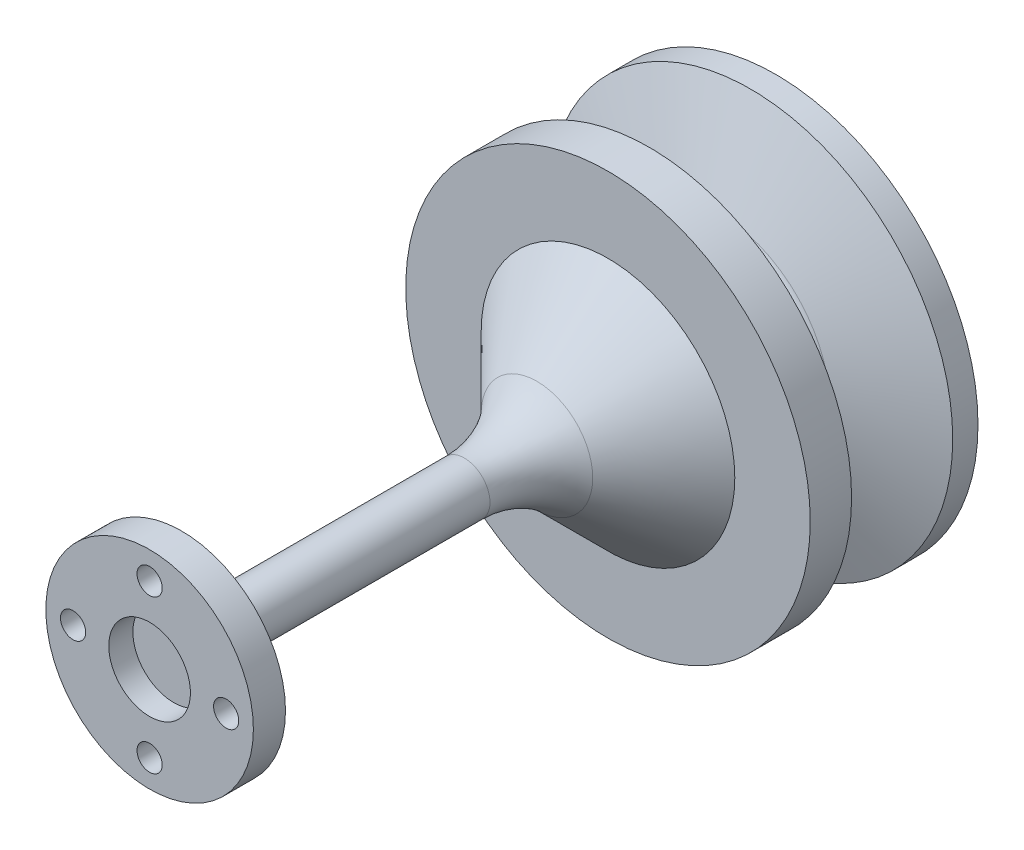
ISO-10303-21;
HEADER;
FILE_DESCRIPTION(('STEP AP214'),'2;1');
FILE_NAME('part.step','',(''),(''),'','','');
FILE_SCHEMA(('AUTOMOTIVE_DESIGN { 1 0 10303 214 1 1 1 1 }'));
ENDSEC;
DATA;
#1=APPLICATION_CONTEXT('core data for automotive mechanical design processes');
#2=APPLICATION_PROTOCOL_DEFINITION('international standard','automotive_design',2000,#1);
#3=PRODUCT_CONTEXT('',#1,'mechanical');
#4=PRODUCT('Part','Part','',(#3));
#5=PRODUCT_RELATED_PRODUCT_CATEGORY('part','',(#4));
#6=PRODUCT_DEFINITION_FORMATION('','',#4);
#7=PRODUCT_DEFINITION_CONTEXT('part definition',#1,'design');
#8=PRODUCT_DEFINITION('design','',#6,#7);
#9=PRODUCT_DEFINITION_SHAPE('','',#8);
#10=(LENGTH_UNIT() NAMED_UNIT(*) SI_UNIT(.MILLI.,.METRE.));
#11=(NAMED_UNIT(*) PLANE_ANGLE_UNIT() SI_UNIT($,.RADIAN.));
#12=(NAMED_UNIT(*) SI_UNIT($,.STERADIAN.) SOLID_ANGLE_UNIT());
#13=UNCERTAINTY_MEASURE_WITH_UNIT(LENGTH_MEASURE(1.E-05),#10,'distance_accuracy_value','');
#14=(GEOMETRIC_REPRESENTATION_CONTEXT(3) GLOBAL_UNCERTAINTY_ASSIGNED_CONTEXT((#13)) GLOBAL_UNIT_ASSIGNED_CONTEXT((#10,
#11,#12)) REPRESENTATION_CONTEXT('',''));
#15=CARTESIAN_POINT('',(0.,0.,0.));
#16=DIRECTION('',(0.,0.,1.));
#17=DIRECTION('',(1.,0.,0.));
#18=AXIS2_PLACEMENT_3D('',#15,#16,#17);
#19=CARTESIAN_POINT('',(0.,0.,7.5));
#20=DIRECTION('',(0.,0.,-1.));
#21=DIRECTION('',(-1.,0.,0.));
#22=AXIS2_PLACEMENT_3D('',#19,#20,#21);
#23=CYLINDRICAL_SURFACE('',#22,20.);
#24=CARTESIAN_POINT('',(0.,0.,5.));
#25=DIRECTION('',(0.,0.,1.));
#26=DIRECTION('',(1.,0.,0.));
#27=AXIS2_PLACEMENT_3D('',#24,#25,#26);
#28=CIRCLE('',#27,20.);
#29=CARTESIAN_POINT('',(20.,0.,5.));
#30=VERTEX_POINT('',#29);
#31=EDGE_CURVE('E70',#30,#30,#28,.T.);
#32=ORIENTED_EDGE('',*,*,#31,.T.);
#33=EDGE_LOOP('',(#32));
#34=FACE_BOUND('',#33,.T.);
#35=CARTESIAN_POINT('',(0.,0.,9.0875));
#36=DIRECTION('',(0.,0.,1.));
#37=DIRECTION('',(1.,0.,0.));
#38=AXIS2_PLACEMENT_3D('',#35,#36,#37);
#39=CIRCLE('',#38,20.);
#40=CARTESIAN_POINT('',(20.,0.,9.0875));
#41=VERTEX_POINT('',#40);
#42=EDGE_CURVE('E80',#41,#41,#39,.T.);
#43=ORIENTED_EDGE('',*,*,#42,.F.);
#44=EDGE_LOOP('',(#43));
#45=FACE_BOUND('',#44,.T.);
#46=ADVANCED_FACE('F38',(#34,#45),#23,.T.);
#47=CARTESIAN_POINT('',(0.,0.,5.));
#48=DIRECTION('',(0.,0.,1.));
#49=DIRECTION('',(1.,0.,0.));
#50=AXIS2_PLACEMENT_3D('',#47,#48,#49);
#51=CONICAL_SURFACE('',#50,20.,1.21861155690498);
#52=CARTESIAN_POINT('',(0.,0.,1.73418644074159));
#53=DIRECTION('',(0.,0.,1.));
#54=DIRECTION('',(1.,0.,0.));
#55=AXIS2_PLACEMENT_3D('',#52,#53,#54);
#56=CIRCLE('',#55,11.1135861888469);
#57=CARTESIAN_POINT('',(11.1135861888469,0.,1.73418644074159));
#58=VERTEX_POINT('',#57);
#59=EDGE_CURVE('E58',#58,#58,#56,.T.);
#60=ORIENTED_EDGE('',*,*,#59,.T.);
#61=EDGE_LOOP('',(#60));
#62=FACE_BOUND('',#61,.T.);
#63=ORIENTED_EDGE('',*,*,#31,.F.);
#64=EDGE_LOOP('',(#63));
#65=FACE_BOUND('',#64,.T.);
#66=ADVANCED_FACE('F169',(#62,#65),#51,.T.);
#67=CARTESIAN_POINT('',(0.,0.,15.7885726147612));
#68=DIRECTION('',(0.,0.,1.));
#69=DIRECTION('',(1.,0.,0.));
#70=AXIS2_PLACEMENT_3D('',#67,#68,#69);
#71=CYLINDRICAL_SURFACE('',#70,10.);
#72=CARTESIAN_POINT('',(0.,0.,0.138530198912253));
#73=DIRECTION('',(0.,0.,1.));
#74=DIRECTION('',(1.,0.,0.));
#75=AXIS2_PLACEMENT_3D('',#72,#73,#74);
#76=CIRCLE('',#75,10.);
#77=CARTESIAN_POINT('',(10.,0.,0.138530198912253));
#78=VERTEX_POINT('',#77);
#79=EDGE_CURVE('E53',#78,#78,#76,.F.);
#80=ORIENTED_EDGE('',*,*,#79,.T.);
#81=EDGE_LOOP('',(#80));
#82=FACE_BOUND('',#81,.T.);
#83=CARTESIAN_POINT('',(0.,0.,-0.138530198912256));
#84=DIRECTION('',(0.,0.,1.));
#85=DIRECTION('',(1.,0.,0.));
#86=AXIS2_PLACEMENT_3D('',#83,#84,#85);
#87=CIRCLE('',#86,10.);
#88=CARTESIAN_POINT('',(10.,0.,-0.138530198912256));
#89=VERTEX_POINT('',#88);
#90=EDGE_CURVE('E64',#89,#89,#87,.T.);
#91=ORIENTED_EDGE('',*,*,#90,.T.);
#92=EDGE_LOOP('',(#91));
#93=FACE_BOUND('',#92,.T.);
#94=ADVANCED_FACE('F176',(#82,#93),#71,.T.);
#95=CARTESIAN_POINT('',(0.,0.,-1.32493643818434));
#96=DIRECTION('',(0.,0.,-1.));
#97=DIRECTION('',(-1.,0.,0.));
#98=AXIS2_PLACEMENT_3D('',#95,#96,#97);
#99=CONICAL_SURFACE('',#98,10.,1.21861155690498);
#100=CARTESIAN_POINT('',(0.,0.,-1.73418644074159));
#101=DIRECTION('',(0.,0.,-1.));
#102=DIRECTION('',(-1.,0.,0.));
#103=AXIS2_PLACEMENT_3D('',#100,#101,#102);
#104=CIRCLE('',#103,11.1135861888469);
#105=CARTESIAN_POINT('',(-11.1135861888469,0.,-1.73418644074159));
#106=VERTEX_POINT('',#105);
#107=EDGE_CURVE('E61',#106,#106,#104,.T.);
#108=ORIENTED_EDGE('',*,*,#107,.T.);
#109=EDGE_LOOP('',(#108));
#110=FACE_BOUND('',#109,.T.);
#111=CARTESIAN_POINT('',(0.,0.,-5.));
#112=DIRECTION('',(0.,0.,1.));
#113=DIRECTION('',(1.,0.,0.));
#114=AXIS2_PLACEMENT_3D('',#111,#112,#113);
#115=CIRCLE('',#114,20.);
#116=CARTESIAN_POINT('',(20.,0.,-5.));
#117=VERTEX_POINT('',#116);
#118=EDGE_CURVE('E73',#117,#117,#115,.T.);
#119=ORIENTED_EDGE('',*,*,#118,.T.);
#120=EDGE_LOOP('',(#119));
#121=FACE_BOUND('',#120,.T.);
#122=ADVANCED_FACE('F192',(#110,#121),#99,.T.);
#123=CARTESIAN_POINT('',(0.,0.,-7.5));
#124=DIRECTION('',(0.,0.,1.));
#125=DIRECTION('',(1.,0.,0.));
#126=AXIS2_PLACEMENT_3D('',#123,#124,#125);
#127=PLANE('',#126);
#128=CARTESIAN_POINT('',(0.,0.,-7.5));
#129=DIRECTION('',(0.,0.,1.));
#130=DIRECTION('',(1.,0.,0.));
#131=AXIS2_PLACEMENT_3D('',#128,#129,#130);
#132=CIRCLE('',#131,5.);
#133=CARTESIAN_POINT('',(5.,0.,-7.5));
#134=VERTEX_POINT('',#133);
#135=EDGE_CURVE('E76',#134,#134,#132,.T.);
#136=ORIENTED_EDGE('',*,*,#135,.T.);
#137=EDGE_LOOP('',(#136));
#138=FACE_BOUND('',#137,.T.);
#139=CARTESIAN_POINT('',(0.,0.,-7.5));
#140=DIRECTION('',(0.,0.,1.));
#141=DIRECTION('',(1.,0.,0.));
#142=AXIS2_PLACEMENT_3D('',#139,#140,#141);
#143=CIRCLE('',#142,20.);
#144=CARTESIAN_POINT('',(20.,0.,-7.5));
#145=VERTEX_POINT('',#144);
#146=EDGE_CURVE('E67',#145,#145,#143,.T.);
#147=ORIENTED_EDGE('',*,*,#146,.F.);
#148=EDGE_LOOP('',(#147));
#149=FACE_BOUND('',#148,.T.);
#150=ADVANCED_FACE('F184',(#138,#149),#127,.F.);
#151=ORIENTED_EDGE('',*,*,#146,.T.);
#152=EDGE_LOOP('',(#151));
#153=FACE_BOUND('',#152,.T.);
#154=ORIENTED_EDGE('',*,*,#118,.F.);
#155=EDGE_LOOP('',(#154));
#156=FACE_BOUND('',#155,.T.);
#157=ADVANCED_FACE('F172',(#153,#156),#23,.T.);
#158=CARTESIAN_POINT('',(0.,0.,-0.138530198912255));
#159=DIRECTION('',(0.,0.,1.));
#160=DIRECTION('',(1.,0.,0.));
#161=AXIS2_PLACEMENT_3D('',#158,#159,#160);
#162=TOROIDAL_SURFACE('',#161,11.7,1.7);
#163=ORIENTED_EDGE('',*,*,#107,.F.);
#164=EDGE_LOOP('',(#163));
#165=FACE_BOUND('',#164,.T.);
#166=ORIENTED_EDGE('',*,*,#90,.F.);
#167=EDGE_LOOP('',(#166));
#168=FACE_BOUND('',#167,.T.);
#169=ADVANCED_FACE('F183',(#165,#168),#162,.F.);
#170=CARTESIAN_POINT('',(0.,0.,0.138530198912253));
#171=DIRECTION('',(0.,0.,1.));
#172=DIRECTION('',(1.,0.,0.));
#173=AXIS2_PLACEMENT_3D('',#170,#171,#172);
#174=TOROIDAL_SURFACE('',#173,11.7,1.7);
#175=ORIENTED_EDGE('',*,*,#79,.F.);
#176=EDGE_LOOP('',(#175));
#177=FACE_BOUND('',#176,.T.);
#178=ORIENTED_EDGE('',*,*,#59,.F.);
#179=EDGE_LOOP('',(#178));
#180=FACE_BOUND('',#179,.T.);
#181=ADVANCED_FACE('F190',(#177,#180),#174,.F.);
#182=CARTESIAN_POINT('',(0.,0.,-7.5));
#183=DIRECTION('',(0.,0.,1.));
#184=DIRECTION('',(1.,0.,0.));
#185=AXIS2_PLACEMENT_3D('',#182,#183,#184);
#186=CYLINDRICAL_SURFACE('',#185,5.);
#187=ORIENTED_EDGE('',*,*,#135,.F.);
#188=EDGE_LOOP('',(#187));
#189=FACE_BOUND('',#188,.T.);
#190=CARTESIAN_POINT('',(0.,0.,7.5));
#191=DIRECTION('',(0.,0.,1.));
#192=DIRECTION('',(1.,0.,0.));
#193=AXIS2_PLACEMENT_3D('',#190,#191,#192);
#194=CIRCLE('',#193,5.);
#195=CARTESIAN_POINT('',(5.,0.,7.5));
#196=VERTEX_POINT('',#195);
#197=EDGE_CURVE('E77',#196,#196,#194,.T.);
#198=ORIENTED_EDGE('',*,*,#197,.T.);
#199=EDGE_LOOP('',(#198));
#200=FACE_BOUND('',#199,.T.);
#201=ADVANCED_FACE('F207',(#189,#200),#186,.F.);
#202=CARTESIAN_POINT('',(0.,0.,7.5));
#203=DIRECTION('',(0.,0.,1.));
#204=DIRECTION('',(1.,0.,0.));
#205=AXIS2_PLACEMENT_3D('',#202,#203,#204);
#206=PLANE('',#205);
#207=ORIENTED_EDGE('',*,*,#197,.F.);
#208=EDGE_LOOP('',(#207));
#209=FACE_BOUND('',#208,.T.);
#210=ADVANCED_FACE('F210',(#209),#206,.F.);
#211=CARTESIAN_POINT('',(0.,0.,9.0875));
#212=DIRECTION('',(0.,0.,1.));
#213=DIRECTION('',(1.,0.,0.));
#214=AXIS2_PLACEMENT_3D('',#211,#212,#213);
#215=PLANE('',#214);
#216=CARTESIAN_POINT('',(0.,0.,9.0875));
#217=DIRECTION('',(0.,0.,1.));
#218=DIRECTION('',(1.,0.,0.));
#219=AXIS2_PLACEMENT_3D('',#216,#217,#218);
#220=CIRCLE('',#219,12.5400000000001);
#221=CARTESIAN_POINT('',(12.5400000000001,0.,9.0875));
#222=VERTEX_POINT('',#221);
#223=EDGE_CURVE('E49',#222,#222,#220,.F.);
#224=ORIENTED_EDGE('',*,*,#223,.T.);
#225=EDGE_LOOP('',(#224));
#226=FACE_BOUND('',#225,.T.);
#227=ORIENTED_EDGE('',*,*,#42,.T.);
#228=EDGE_LOOP('',(#227));
#229=FACE_BOUND('',#228,.T.);
#230=ADVANCED_FACE('F214',(#226,#229),#215,.T.);
#231=CARTESIAN_POINT('',(0.,0.,51.2388));
#232=DIRECTION('',(0.,0.,-1.));
#233=DIRECTION('',(-1.,0.,0.));
#234=AXIS2_PLACEMENT_3D('',#231,#232,#233);
#235=CYLINDRICAL_SURFACE('',#234,2.54);
#236=CARTESIAN_POINT('',(0.,0.,23.2959097937106));
#237=DIRECTION('',(0.,0.,1.));
#238=DIRECTION('',(1.,0.,0.));
#239=AXIS2_PLACEMENT_3D('',#236,#237,#238);
#240=CIRCLE('',#239,2.54);
#241=CARTESIAN_POINT('',(2.54,0.,23.2959097937106));
#242=VERTEX_POINT('',#241);
#243=EDGE_CURVE('E45',#242,#242,#240,.T.);
#244=ORIENTED_EDGE('',*,*,#243,.T.);
#245=EDGE_LOOP('',(#244));
#246=FACE_BOUND('',#245,.T.);
#247=CARTESIAN_POINT('',(0.,0.,51.2388));
#248=DIRECTION('',(0.,0.,1.));
#249=DIRECTION('',(1.,0.,0.));
#250=AXIS2_PLACEMENT_3D('',#247,#248,#249);
#251=CIRCLE('',#250,2.54);
#252=CARTESIAN_POINT('',(2.54,0.,51.2388));
#253=VERTEX_POINT('',#252);
#254=EDGE_CURVE('E85',#253,#253,#251,.T.);
#255=ORIENTED_EDGE('',*,*,#254,.F.);
#256=EDGE_LOOP('',(#255));
#257=FACE_BOUND('',#256,.T.);
#258=ADVANCED_FACE('F152',(#246,#257),#235,.T.);
#259=CARTESIAN_POINT('',(0.,0.,54.4138));
#260=DIRECTION('',(0.,0.,-1.));
#261=DIRECTION('',(-1.,0.,0.));
#262=AXIS2_PLACEMENT_3D('',#259,#260,#261);
#263=CYLINDRICAL_SURFACE('',#262,10.2616);
#264=CARTESIAN_POINT('',(0.,0.,54.4138));
#265=DIRECTION('',(0.,0.,1.));
#266=DIRECTION('',(1.,0.,0.));
#267=AXIS2_PLACEMENT_3D('',#264,#265,#266);
#268=CIRCLE('',#267,10.2616);
#269=CARTESIAN_POINT('',(10.2616,0.,54.4138));
#270=VERTEX_POINT('',#269);
#271=EDGE_CURVE('E88',#270,#270,#268,.T.);
#272=ORIENTED_EDGE('',*,*,#271,.F.);
#273=EDGE_LOOP('',(#272));
#274=FACE_BOUND('',#273,.T.);
#275=CARTESIAN_POINT('',(0.,0.,51.2388));
#276=DIRECTION('',(0.,0.,1.));
#277=DIRECTION('',(1.,0.,0.));
#278=AXIS2_PLACEMENT_3D('',#275,#276,#277);
#279=CIRCLE('',#278,10.2616);
#280=CARTESIAN_POINT('',(10.2616,0.,51.2388));
#281=VERTEX_POINT('',#280);
#282=EDGE_CURVE('E89',#281,#281,#279,.T.);
#283=ORIENTED_EDGE('',*,*,#282,.T.);
#284=EDGE_LOOP('',(#283));
#285=FACE_BOUND('',#284,.T.);
#286=ADVANCED_FACE('F138',(#274,#285),#263,.T.);
#287=CARTESIAN_POINT('',(0.,0.,54.4138));
#288=DIRECTION('',(0.,0.,1.));
#289=DIRECTION('',(1.,0.,0.));
#290=AXIS2_PLACEMENT_3D('',#287,#288,#289);
#291=PLANE('',#290);
#292=CARTESIAN_POINT('',(0.,0.,54.4138));
#293=DIRECTION('',(0.,0.,1.));
#294=DIRECTION('',(1.,0.,0.));
#295=AXIS2_PLACEMENT_3D('',#292,#293,#294);
#296=CIRCLE('',#295,4.0386);
#297=CARTESIAN_POINT('',(4.0386,0.,54.4138));
#298=VERTEX_POINT('',#297);
#299=EDGE_CURVE('E119',#298,#298,#296,.T.);
#300=ORIENTED_EDGE('',*,*,#299,.F.);
#301=EDGE_LOOP('',(#300));
#302=FACE_BOUND('',#301,.T.);
#303=CARTESIAN_POINT('',(-7.5692,0.,54.4138));
#304=DIRECTION('',(0.,0.,1.));
#305=DIRECTION('',(0.,1.,0.));
#306=AXIS2_PLACEMENT_3D('',#303,#304,#305);
#307=CIRCLE('',#306,1.2446);
#308=CARTESIAN_POINT('',(-7.5692,1.24459999999997,54.4138));
#309=VERTEX_POINT('',#308);
#310=EDGE_CURVE('E112',#309,#309,#307,.T.);
#311=ORIENTED_EDGE('',*,*,#310,.F.);
#312=EDGE_LOOP('',(#311));
#313=FACE_BOUND('',#312,.T.);
#314=CARTESIAN_POINT('',(0.,-7.5692,54.4138));
#315=DIRECTION('',(0.,0.,1.));
#316=DIRECTION('',(-1.,0.,0.));
#317=AXIS2_PLACEMENT_3D('',#314,#315,#316);
#318=CIRCLE('',#317,1.2446);
#319=CARTESIAN_POINT('',(-1.2446,-7.5692,54.4138));
#320=VERTEX_POINT('',#319);
#321=EDGE_CURVE('E104',#320,#320,#318,.T.);
#322=ORIENTED_EDGE('',*,*,#321,.F.);
#323=EDGE_LOOP('',(#322));
#324=FACE_BOUND('',#323,.T.);
#325=CARTESIAN_POINT('',(7.5692,0.,54.4138));
#326=DIRECTION('',(0.,0.,1.));
#327=DIRECTION('',(0.,-1.,0.));
#328=AXIS2_PLACEMENT_3D('',#325,#326,#327);
#329=CIRCLE('',#328,1.2446);
#330=CARTESIAN_POINT('',(7.56920000000001,-1.24459999999992,54.4138));
#331=VERTEX_POINT('',#330);
#332=EDGE_CURVE('E105',#331,#331,#329,.T.);
#333=ORIENTED_EDGE('',*,*,#332,.F.);
#334=EDGE_LOOP('',(#333));
#335=FACE_BOUND('',#334,.T.);
#336=CARTESIAN_POINT('',(0.,7.5692,54.4138));
#337=DIRECTION('',(0.,0.,1.));
#338=DIRECTION('',(1.,0.,0.));
#339=AXIS2_PLACEMENT_3D('',#336,#337,#338);
#340=CIRCLE('',#339,1.2446);
#341=CARTESIAN_POINT('',(1.2446,7.5692,54.4138));
#342=VERTEX_POINT('',#341);
#343=EDGE_CURVE('E97',#342,#342,#340,.T.);
#344=ORIENTED_EDGE('',*,*,#343,.F.);
#345=EDGE_LOOP('',(#344));
#346=FACE_BOUND('',#345,.T.);
#347=ORIENTED_EDGE('',*,*,#271,.T.);
#348=EDGE_LOOP('',(#347));
#349=FACE_BOUND('',#348,.T.);
#350=ADVANCED_FACE('F134',(#302,#313,#324,#335,#346,#349),#291,.T.);
#351=CARTESIAN_POINT('',(0.,0.,51.2388));
#352=DIRECTION('',(0.,0.,1.));
#353=DIRECTION('',(1.,0.,0.));
#354=AXIS2_PLACEMENT_3D('',#351,#352,#353);
#355=PLANE('',#354);
#356=CARTESIAN_POINT('',(-7.5692,0.,51.2388));
#357=DIRECTION('',(0.,0.,1.));
#358=DIRECTION('',(1.,0.,0.));
#359=AXIS2_PLACEMENT_3D('',#356,#357,#358);
#360=CIRCLE('',#359,1.2446);
#361=CARTESIAN_POINT('',(-6.3246,0.,51.2388));
#362=VERTEX_POINT('',#361);
#363=EDGE_CURVE('E100',#362,#362,#360,.F.);
#364=ORIENTED_EDGE('',*,*,#363,.F.);
#365=EDGE_LOOP('',(#364));
#366=FACE_BOUND('',#365,.T.);
#367=CARTESIAN_POINT('',(0.,-7.5692,51.2388));
#368=DIRECTION('',(0.,0.,1.));
#369=DIRECTION('',(1.,0.,0.));
#370=AXIS2_PLACEMENT_3D('',#367,#368,#369);
#371=CIRCLE('',#370,1.2446);
#372=CARTESIAN_POINT('',(1.2446,-7.5692,51.2388));
#373=VERTEX_POINT('',#372);
#374=EDGE_CURVE('E109',#373,#373,#371,.F.);
#375=ORIENTED_EDGE('',*,*,#374,.F.);
#376=EDGE_LOOP('',(#375));
#377=FACE_BOUND('',#376,.T.);
#378=CARTESIAN_POINT('',(7.5692,0.,51.2388));
#379=DIRECTION('',(0.,0.,1.));
#380=DIRECTION('',(1.,0.,0.));
#381=AXIS2_PLACEMENT_3D('',#378,#379,#380);
#382=CIRCLE('',#381,1.2446);
#383=CARTESIAN_POINT('',(8.8138,0.,51.2388));
#384=VERTEX_POINT('',#383);
#385=EDGE_CURVE('E101',#384,#384,#382,.F.);
#386=ORIENTED_EDGE('',*,*,#385,.F.);
#387=EDGE_LOOP('',(#386));
#388=FACE_BOUND('',#387,.T.);
#389=CARTESIAN_POINT('',(0.,7.5692,51.2388));
#390=DIRECTION('',(0.,0.,1.));
#391=DIRECTION('',(1.,0.,0.));
#392=AXIS2_PLACEMENT_3D('',#389,#390,#391);
#393=CIRCLE('',#392,1.2446);
#394=CARTESIAN_POINT('',(1.2446,7.5692,51.2388));
#395=VERTEX_POINT('',#394);
#396=EDGE_CURVE('E92',#395,#395,#393,.F.);
#397=ORIENTED_EDGE('',*,*,#396,.F.);
#398=EDGE_LOOP('',(#397));
#399=FACE_BOUND('',#398,.T.);
#400=ORIENTED_EDGE('',*,*,#254,.T.);
#401=EDGE_LOOP('',(#400));
#402=FACE_BOUND('',#401,.T.);
#403=ORIENTED_EDGE('',*,*,#282,.F.);
#404=EDGE_LOOP('',(#403));
#405=FACE_BOUND('',#404,.T.);
#406=ADVANCED_FACE('F137',(#366,#377,#388,#399,#402,#405),#355,.F.);
#407=CARTESIAN_POINT('',(0.,7.5692,-7.501));
#408=DIRECTION('',(0.,0.,1.));
#409=DIRECTION('',(1.,0.,0.));
#410=AXIS2_PLACEMENT_3D('',#407,#408,#409);
#411=CYLINDRICAL_SURFACE('',#410,1.2446);
#412=ORIENTED_EDGE('',*,*,#343,.T.);
#413=EDGE_LOOP('',(#412));
#414=FACE_BOUND('',#413,.T.);
#415=ORIENTED_EDGE('',*,*,#396,.T.);
#416=EDGE_LOOP('',(#415));
#417=FACE_BOUND('',#416,.T.);
#418=ADVANCED_FACE('F157',(#414,#417),#411,.F.);
#419=CARTESIAN_POINT('',(7.5692,0.,-7.501));
#420=DIRECTION('',(0.,0.,1.));
#421=DIRECTION('',(1.,0.,0.));
#422=AXIS2_PLACEMENT_3D('',#419,#420,#421);
#423=CYLINDRICAL_SURFACE('',#422,1.2446);
#424=ORIENTED_EDGE('',*,*,#332,.T.);
#425=EDGE_LOOP('',(#424));
#426=FACE_BOUND('',#425,.T.);
#427=ORIENTED_EDGE('',*,*,#385,.T.);
#428=EDGE_LOOP('',(#427));
#429=FACE_BOUND('',#428,.T.);
#430=ADVANCED_FACE('F163',(#426,#429),#423,.F.);
#431=CARTESIAN_POINT('',(0.,-7.5692,-7.501));
#432=DIRECTION('',(0.,0.,1.));
#433=DIRECTION('',(1.,0.,0.));
#434=AXIS2_PLACEMENT_3D('',#431,#432,#433);
#435=CYLINDRICAL_SURFACE('',#434,1.2446);
#436=ORIENTED_EDGE('',*,*,#321,.T.);
#437=EDGE_LOOP('',(#436));
#438=FACE_BOUND('',#437,.T.);
#439=ORIENTED_EDGE('',*,*,#374,.T.);
#440=EDGE_LOOP('',(#439));
#441=FACE_BOUND('',#440,.T.);
#442=ADVANCED_FACE('F362',(#438,#441),#435,.F.);
#443=CARTESIAN_POINT('',(-7.5692,0.,-7.501));
#444=DIRECTION('',(0.,0.,1.));
#445=DIRECTION('',(1.,0.,0.));
#446=AXIS2_PLACEMENT_3D('',#443,#444,#445);
#447=CYLINDRICAL_SURFACE('',#446,1.2446);
#448=ORIENTED_EDGE('',*,*,#310,.T.);
#449=EDGE_LOOP('',(#448));
#450=FACE_BOUND('',#449,.T.);
#451=ORIENTED_EDGE('',*,*,#363,.T.);
#452=EDGE_LOOP('',(#451));
#453=FACE_BOUND('',#452,.T.);
#454=ADVANCED_FACE('F130',(#450,#453),#447,.F.);
#455=CARTESIAN_POINT('',(0.,0.,52.03255));
#456=DIRECTION('',(0.,0.,1.));
#457=DIRECTION('',(1.,0.,0.));
#458=AXIS2_PLACEMENT_3D('',#455,#456,#457);
#459=CYLINDRICAL_SURFACE('',#458,4.0386);
#460=CARTESIAN_POINT('',(0.,0.,52.03255));
#461=DIRECTION('',(0.,0.,1.));
#462=DIRECTION('',(1.,0.,0.));
#463=AXIS2_PLACEMENT_3D('',#460,#461,#462);
#464=CIRCLE('',#463,4.0386);
#465=CARTESIAN_POINT('',(4.0386,0.,52.03255));
#466=VERTEX_POINT('',#465);
#467=EDGE_CURVE('E108',#466,#466,#464,.T.);
#468=CARTESIAN_POINT('',(4.0386,0.,52.03255));
#469=CARTESIAN_POINT('',(4.0386,0.,52.0573546875));
#470=CARTESIAN_POINT('',(4.0386,0.,52.082159375));
#471=CARTESIAN_POINT('',(4.0386,0.,52.13176875));
#472=CARTESIAN_POINT('',(4.0386,0.,52.1565734375));
#473=CARTESIAN_POINT('',(4.0386,0.,52.2061828125));
#474=CARTESIAN_POINT('',(4.0386,0.,52.2309875));
#475=CARTESIAN_POINT('',(4.0386,0.,52.280596875));
#476=CARTESIAN_POINT('',(4.0386,0.,52.3054015625));
#477=CARTESIAN_POINT('',(4.0386,0.,52.3550109375));
#478=CARTESIAN_POINT('',(4.0386,0.,52.379815625));
#479=CARTESIAN_POINT('',(4.0386,0.,52.429425));
#480=CARTESIAN_POINT('',(4.0386,0.,52.4542296875));
#481=CARTESIAN_POINT('',(4.0386,0.,52.5038390625));
#482=CARTESIAN_POINT('',(4.0386,0.,52.52864375));
#483=CARTESIAN_POINT('',(4.0386,0.,52.578253125));
#484=CARTESIAN_POINT('',(4.0386,0.,52.6030578125));
#485=CARTESIAN_POINT('',(4.0386,0.,52.6526671875));
#486=CARTESIAN_POINT('',(4.0386,0.,52.677471875));
#487=CARTESIAN_POINT('',(4.0386,0.,52.72708125));
#488=CARTESIAN_POINT('',(4.0386,0.,52.7518859375));
#489=CARTESIAN_POINT('',(4.0386,0.,52.8014953125));
#490=CARTESIAN_POINT('',(4.0386,0.,52.8263));
#491=CARTESIAN_POINT('',(4.0386,0.,52.875909375));
#492=CARTESIAN_POINT('',(4.0386,0.,52.9007140625));
#493=CARTESIAN_POINT('',(4.0386,0.,52.9503234375));
#494=CARTESIAN_POINT('',(4.0386,0.,52.975128125));
#495=CARTESIAN_POINT('',(4.0386,0.,53.0247375));
#496=CARTESIAN_POINT('',(4.0386,0.,53.0495421875));
#497=CARTESIAN_POINT('',(4.0386,0.,53.0991515625));
#498=CARTESIAN_POINT('',(4.0386,0.,53.12395625));
#499=CARTESIAN_POINT('',(4.0386,0.,53.173565625));
#500=CARTESIAN_POINT('',(4.0386,0.,53.1983703125));
#501=CARTESIAN_POINT('',(4.0386,0.,53.2479796875));
#502=CARTESIAN_POINT('',(4.0386,0.,53.272784375));
#503=CARTESIAN_POINT('',(4.0386,0.,53.32239375));
#504=CARTESIAN_POINT('',(4.0386,0.,53.3471984375));
#505=CARTESIAN_POINT('',(4.0386,0.,53.3968078125));
#506=CARTESIAN_POINT('',(4.0386,0.,53.4216125));
#507=CARTESIAN_POINT('',(4.0386,0.,53.471221875));
#508=CARTESIAN_POINT('',(4.0386,0.,53.4960265625));
#509=CARTESIAN_POINT('',(4.0386,0.,53.5456359375));
#510=CARTESIAN_POINT('',(4.0386,0.,53.570440625));
#511=CARTESIAN_POINT('',(4.0386,0.,53.62005));
#512=CARTESIAN_POINT('',(4.0386,0.,53.6448546875));
#513=CARTESIAN_POINT('',(4.0386,0.,53.6944640625));
#514=CARTESIAN_POINT('',(4.0386,0.,53.71926875));
#515=CARTESIAN_POINT('',(4.0386,0.,53.768878125));
#516=CARTESIAN_POINT('',(4.0386,0.,53.7936828125));
#517=CARTESIAN_POINT('',(4.0386,0.,53.8432921875));
#518=CARTESIAN_POINT('',(4.0386,0.,53.868096875));
#519=CARTESIAN_POINT('',(4.0386,0.,53.91770625));
#520=CARTESIAN_POINT('',(4.0386,0.,53.9425109375));
#521=CARTESIAN_POINT('',(4.0386,0.,53.9921203125));
#522=CARTESIAN_POINT('',(4.0386,0.,54.016925));
#523=CARTESIAN_POINT('',(4.0386,0.,54.066534375));
#524=CARTESIAN_POINT('',(4.0386,0.,54.0913390625));
#525=CARTESIAN_POINT('',(4.0386,0.,54.1409484375));
#526=CARTESIAN_POINT('',(4.0386,0.,54.165753125));
#527=CARTESIAN_POINT('',(4.0386,0.,54.2153625));
#528=CARTESIAN_POINT('',(4.0386,0.,54.2401671875));
#529=CARTESIAN_POINT('',(4.0386,0.,54.2897765625));
#530=CARTESIAN_POINT('',(4.0386,0.,54.31458125));
#531=CARTESIAN_POINT('',(4.0386,0.,54.364190625));
#532=CARTESIAN_POINT('',(4.0386,0.,54.3889953125));
#533=CARTESIAN_POINT('',(4.0386,0.,54.4138));
#534=B_SPLINE_CURVE_WITH_KNOTS('',3,(#468,#469,#470,#471,#472,#473,#474,#475,#476,#477,#478,
#479,#480,#481,#482,#483,#484,#485,#486,#487,#488,#489,#490,#491,#492,#493,#494,#495,#496,#497,
#498,#499,#500,#501,#502,#503,#504,#505,#506,#507,#508,#509,#510,#511,#512,#513,#514,#515,#516,
#517,#518,#519,#520,#521,#522,#523,#524,#525,#526,#527,#528,#529,#530,#531,#532,#533),
.UNSPECIFIED.,.F.,.F.,(4,2,2,2,2,2,2,2,2,2,2,2,2,2,2,2,2,2,2,2,2,2,2,2,2,2,2,2,2,2,2,2,4),(0.,
0.074414062500007,0.148828125000007,0.223242187500007,0.297656250000007,0.372070312500007,
0.446484375000007,0.520898437500007,0.595312500000007,0.669726562500007,0.744140625000007,
0.818554687500007,0.892968750000007,0.967382812500007,1.04179687500001,1.11621093750001,
1.19062500000001,1.26503906250001,1.33945312500001,1.41386718750001,1.48828125000001,
1.56269531250001,1.63710937500001,1.71152343750001,1.78593750000001,1.86035156250001,
1.93476562500001,2.00917968750001,2.08359375000001,2.15800781250001,2.23242187500001,
2.30683593750001,2.38125000000001),.UNSPECIFIED.);
#535=EDGE_CURVE('BSEAM127',#466,#298,#534,.T.);
#536=ORIENTED_EDGE('',*,*,#467,.F.);
#537=ORIENTED_EDGE('',*,*,#299,.T.);
#538=ORIENTED_EDGE('',*,*,#535,.T.);
#539=ORIENTED_EDGE('',*,*,#535,.F.);
#540=EDGE_LOOP('',(#536,#538,#537,#539));
#541=FACE_BOUND('',#540,.T.);
#542=ADVANCED_FACE('F127',(#541),#459,.F.);
#543=CARTESIAN_POINT('',(0.,0.,52.03255));
#544=DIRECTION('',(0.,0.,1.));
#545=DIRECTION('',(1.,0.,0.));
#546=AXIS2_PLACEMENT_3D('',#543,#544,#545);
#547=PLANE('',#546);
#548=ORIENTED_EDGE('',*,*,#467,.T.);
#549=EDGE_LOOP('',(#548));
#550=FACE_BOUND('',#549,.T.);
#551=ADVANCED_FACE('F125',(#550),#547,.T.);
#552=CARTESIAN_POINT('',(0.,0.,9.0875));
#553=DIRECTION('',(0.,0.,-1.));
#554=DIRECTION('',(-1.,0.,0.));
#555=AXIS2_PLACEMENT_3D('',#552,#553,#554);
#556=CONICAL_SURFACE('',#555,12.5400000000001,0.785398163397454);
#557=CARTESIAN_POINT('',(0.,0.,16.1117048968553));
#558=DIRECTION('',(0.,0.,-1.));
#559=DIRECTION('',(-1.,0.,0.));
#560=AXIS2_PLACEMENT_3D('',#557,#558,#559);
#561=CIRCLE('',#560,5.51579510314471);
#562=CARTESIAN_POINT('',(-5.51579510314471,0.,16.1117048968553));
#563=VERTEX_POINT('',#562);
#564=EDGE_CURVE('E10',#563,#563,#561,.T.);
#565=ORIENTED_EDGE('',*,*,#564,.T.);
#566=EDGE_LOOP('',(#565));
#567=FACE_BOUND('',#566,.T.);
#568=ORIENTED_EDGE('',*,*,#223,.F.);
#569=EDGE_LOOP('',(#568));
#570=FACE_BOUND('',#569,.T.);
#571=ADVANCED_FACE('F258',(#567,#570),#556,.T.);
#572=CARTESIAN_POINT('',(0.,0.,23.2959097937106));
#573=DIRECTION('',(0.,0.,1.));
#574=DIRECTION('',(1.,0.,0.));
#575=AXIS2_PLACEMENT_3D('',#572,#573,#574);
#576=TOROIDAL_SURFACE('',#575,12.7,10.16);
#577=ORIENTED_EDGE('',*,*,#564,.F.);
#578=EDGE_LOOP('',(#577));
#579=FACE_BOUND('',#578,.T.);
#580=ORIENTED_EDGE('',*,*,#243,.F.);
#581=EDGE_LOOP('',(#580));
#582=FACE_BOUND('',#581,.T.);
#583=ADVANCED_FACE('F40',(#579,#582),#576,.F.);
#584=CLOSED_SHELL('',(#46,#66,#94,#122,#150,#157,#169,#181,#201,#210,#230,#258,#286,#350,#406,
#418,#430,#442,#454,#542,#551,#571,#583));
#585=MANIFOLD_SOLID_BREP('B2',#584);
#586=ADVANCED_BREP_SHAPE_REPRESENTATION('',(#18,#585),#14);
#587=SHAPE_DEFINITION_REPRESENTATION(#9,#586);
ENDSEC;
END-ISO-10303-21;
